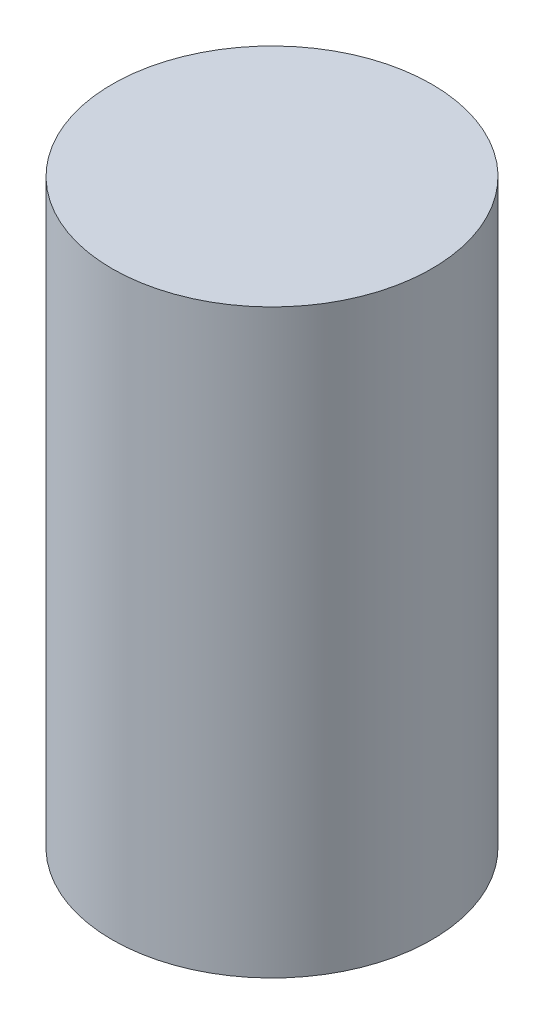
ISO-10303-21;
HEADER;
FILE_DESCRIPTION(('STEP AP214'),'2;1');
FILE_NAME('part.step','',(''),(''),'','','');
FILE_SCHEMA(('AUTOMOTIVE_DESIGN { 1 0 10303 214 1 1 1 1 }'));
ENDSEC;
DATA;
#1=APPLICATION_CONTEXT('core data for automotive mechanical design processes');
#2=APPLICATION_PROTOCOL_DEFINITION('international standard','automotive_design',2000,#1);
#3=PRODUCT_CONTEXT('',#1,'mechanical');
#4=PRODUCT('Part','Part','',(#3));
#5=PRODUCT_RELATED_PRODUCT_CATEGORY('part','',(#4));
#6=PRODUCT_DEFINITION_FORMATION('','',#4);
#7=PRODUCT_DEFINITION_CONTEXT('part definition',#1,'design');
#8=PRODUCT_DEFINITION('design','',#6,#7);
#9=PRODUCT_DEFINITION_SHAPE('','',#8);
#10=(LENGTH_UNIT() NAMED_UNIT(*) SI_UNIT(.MILLI.,.METRE.));
#11=(NAMED_UNIT(*) PLANE_ANGLE_UNIT() SI_UNIT($,.RADIAN.));
#12=(NAMED_UNIT(*) SI_UNIT($,.STERADIAN.) SOLID_ANGLE_UNIT());
#13=UNCERTAINTY_MEASURE_WITH_UNIT(LENGTH_MEASURE(1.E-05),#10,'distance_accuracy_value','');
#14=(GEOMETRIC_REPRESENTATION_CONTEXT(3) GLOBAL_UNCERTAINTY_ASSIGNED_CONTEXT((#13)) GLOBAL_UNIT_ASSIGNED_CONTEXT((#10,
#11,#12)) REPRESENTATION_CONTEXT('',''));
#15=CARTESIAN_POINT('',(0.,0.,0.));
#16=DIRECTION('',(0.,0.,1.));
#17=DIRECTION('',(1.,0.,0.));
#18=AXIS2_PLACEMENT_3D('',#15,#16,#17);
#19=CARTESIAN_POINT('',(0.,120.,0.));
#20=DIRECTION('',(0.,-1.,0.));
#21=DIRECTION('',(0.,0.,-1.));
#22=AXIS2_PLACEMENT_3D('',#19,#20,#21);
#23=CYLINDRICAL_SURFACE('',#22,33.);
#24=CARTESIAN_POINT('',(0.,120.,0.));
#25=DIRECTION('',(0.,1.,0.));
#26=DIRECTION('',(0.,0.,1.));
#27=AXIS2_PLACEMENT_3D('',#24,#25,#26);
#28=CIRCLE('',#27,33.);
#29=CARTESIAN_POINT('',(0.,120.,33.));
#30=VERTEX_POINT('',#29);
#31=EDGE_CURVE('E10',#30,#30,#28,.T.);
#32=ORIENTED_EDGE('',*,*,#31,.F.);
#33=EDGE_LOOP('',(#32));
#34=FACE_BOUND('',#33,.T.);
#35=CARTESIAN_POINT('',(0.,0.,0.));
#36=DIRECTION('',(0.,1.,0.));
#37=DIRECTION('',(0.,0.,1.));
#38=AXIS2_PLACEMENT_3D('',#35,#36,#37);
#39=CIRCLE('',#38,33.);
#40=CARTESIAN_POINT('',(0.,0.,33.));
#41=VERTEX_POINT('',#40);
#42=EDGE_CURVE('E35',#41,#41,#39,.T.);
#43=ORIENTED_EDGE('',*,*,#42,.T.);
#44=EDGE_LOOP('',(#43));
#45=FACE_BOUND('',#44,.T.);
#46=ADVANCED_FACE('F32',(#34,#45),#23,.T.);
#47=CARTESIAN_POINT('',(0.,120.,0.));
#48=DIRECTION('',(0.,1.,0.));
#49=DIRECTION('',(0.,0.,1.));
#50=AXIS2_PLACEMENT_3D('',#47,#48,#49);
#51=PLANE('',#50);
#52=ORIENTED_EDGE('',*,*,#31,.T.);
#53=EDGE_LOOP('',(#52));
#54=FACE_BOUND('',#53,.T.);
#55=ADVANCED_FACE('F47',(#54),#51,.T.);
#56=CARTESIAN_POINT('',(0.,0.,0.));
#57=DIRECTION('',(0.,1.,0.));
#58=DIRECTION('',(0.,0.,1.));
#59=AXIS2_PLACEMENT_3D('',#56,#57,#58);
#60=PLANE('',#59);
#61=ORIENTED_EDGE('',*,*,#42,.F.);
#62=EDGE_LOOP('',(#61));
#63=FACE_BOUND('',#62,.T.);
#64=ADVANCED_FACE('F45',(#63),#60,.F.);
#65=CLOSED_SHELL('',(#46,#55,#64));
#66=MANIFOLD_SOLID_BREP('B2',#65);
#67=ADVANCED_BREP_SHAPE_REPRESENTATION('',(#18,#66),#14);
#68=SHAPE_DEFINITION_REPRESENTATION(#9,#67);
ENDSEC;
END-ISO-10303-21;
